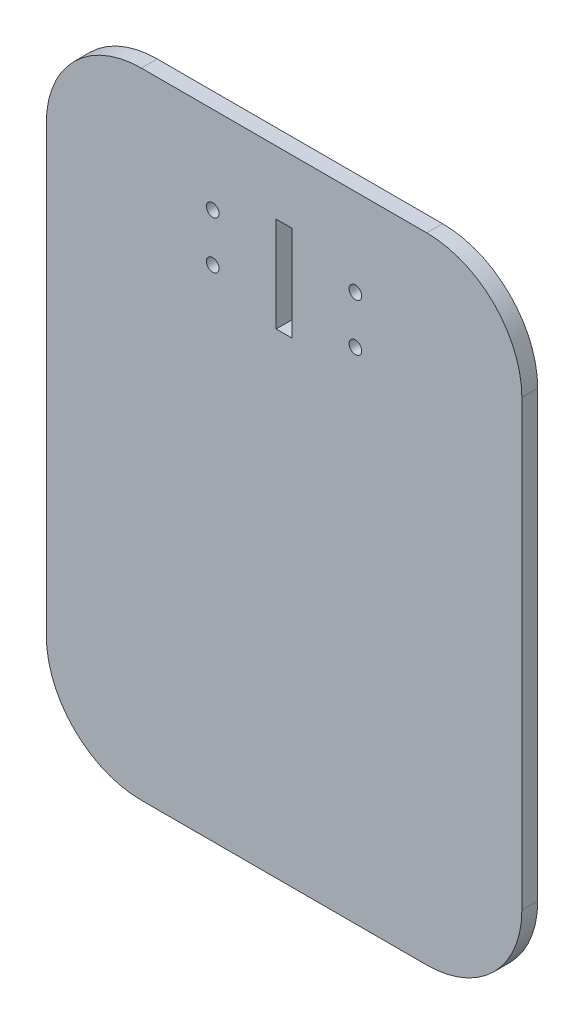
ISO-10303-21;
HEADER;
FILE_DESCRIPTION(('STEP AP214'),'2;1');
FILE_NAME('part.step','',(''),(''),'','','');
FILE_SCHEMA(('AUTOMOTIVE_DESIGN { 1 0 10303 214 1 1 1 1 }'));
ENDSEC;
DATA;
#1=APPLICATION_CONTEXT('core data for automotive mechanical design processes');
#2=APPLICATION_PROTOCOL_DEFINITION('international standard','automotive_design',2000,#1);
#3=PRODUCT_CONTEXT('',#1,'mechanical');
#4=PRODUCT('Part','Part','',(#3));
#5=PRODUCT_RELATED_PRODUCT_CATEGORY('part','',(#4));
#6=PRODUCT_DEFINITION_FORMATION('','',#4);
#7=PRODUCT_DEFINITION_CONTEXT('part definition',#1,'design');
#8=PRODUCT_DEFINITION('design','',#6,#7);
#9=PRODUCT_DEFINITION_SHAPE('','',#8);
#10=(LENGTH_UNIT() NAMED_UNIT(*) SI_UNIT(.MILLI.,.METRE.));
#11=(NAMED_UNIT(*) PLANE_ANGLE_UNIT() SI_UNIT($,.RADIAN.));
#12=(NAMED_UNIT(*) SI_UNIT($,.STERADIAN.) SOLID_ANGLE_UNIT());
#13=UNCERTAINTY_MEASURE_WITH_UNIT(LENGTH_MEASURE(1.E-05),#10,'distance_accuracy_value','');
#14=(GEOMETRIC_REPRESENTATION_CONTEXT(3) GLOBAL_UNCERTAINTY_ASSIGNED_CONTEXT((#13)) GLOBAL_UNIT_ASSIGNED_CONTEXT((#10,
#11,#12)) REPRESENTATION_CONTEXT('',''));
#15=CARTESIAN_POINT('',(0.,0.,0.));
#16=DIRECTION('',(0.,0.,1.));
#17=DIRECTION('',(1.,0.,0.));
#18=AXIS2_PLACEMENT_3D('',#15,#16,#17);
#19=CARTESIAN_POINT('',(0.,0.,5.));
#20=DIRECTION('',(0.,0.,1.));
#21=DIRECTION('',(1.,0.,0.));
#22=AXIS2_PLACEMENT_3D('',#19,#20,#21);
#23=PLANE('',#22);
#24=CARTESIAN_POINT('',(-144.79547436503,96.7780172413793,5.));
#25=DIRECTION('',(0.,0.,1.));
#26=DIRECTION('',(-1.,0.,0.));
#27=AXIS2_PLACEMENT_3D('',#24,#25,#26);
#28=CIRCLE('',#27,2.);
#29=CARTESIAN_POINT('',(-146.79547436503,96.7780172413793,5.));
#30=VERTEX_POINT('',#29);
#31=EDGE_CURVE('E412',#30,#30,#28,.T.);
#32=ORIENTED_EDGE('',*,*,#31,.F.);
#33=EDGE_LOOP('',(#32));
#34=FACE_BOUND('',#33,.T.);
#35=CARTESIAN_POINT('',(-189.79547436503,96.7780172413793,5.));
#36=DIRECTION('',(0.,0.,1.));
#37=DIRECTION('',(1.,0.,0.));
#38=AXIS2_PLACEMENT_3D('',#35,#36,#37);
#39=CIRCLE('',#38,2.);
#40=CARTESIAN_POINT('',(-187.79547436503,96.7780172413793,5.));
#41=VERTEX_POINT('',#40);
#42=EDGE_CURVE('E416',#41,#41,#39,.T.);
#43=ORIENTED_EDGE('',*,*,#42,.F.);
#44=EDGE_LOOP('',(#43));
#45=FACE_BOUND('',#44,.T.);
#46=CARTESIAN_POINT('',(-189.79547436503,111.778017241379,5.));
#47=DIRECTION('',(0.,0.,1.));
#48=DIRECTION('',(-1.,0.,0.));
#49=AXIS2_PLACEMENT_3D('',#46,#47,#48);
#50=CIRCLE('',#49,2.);
#51=CARTESIAN_POINT('',(-191.79547436503,111.778017241379,5.));
#52=VERTEX_POINT('',#51);
#53=EDGE_CURVE('E433',#52,#52,#50,.T.);
#54=ORIENTED_EDGE('',*,*,#53,.F.);
#55=EDGE_LOOP('',(#54));
#56=FACE_BOUND('',#55,.T.);
#57=CARTESIAN_POINT('',(-144.79547436503,111.778017241379,5.));
#58=DIRECTION('',(0.,0.,1.));
#59=DIRECTION('',(1.,0.,0.));
#60=AXIS2_PLACEMENT_3D('',#57,#58,#59);
#61=CIRCLE('',#60,2.);
#62=CARTESIAN_POINT('',(-142.79547436503,111.778017241379,5.));
#63=VERTEX_POINT('',#62);
#64=EDGE_CURVE('E424',#63,#63,#61,.T.);
#65=ORIENTED_EDGE('',*,*,#64,.F.);
#66=EDGE_LOOP('',(#65));
#67=FACE_BOUND('',#66,.T.);
#68=DIRECTION('',(1.,0.,0.));
#69=VECTOR('',#68,1.);
#70=CARTESIAN_POINT('',(-242.29547436503,-60.7219827586207,5.));
#71=LINE('',#70,#69);
#72=CARTESIAN_POINT('',(-212.29547436503,-60.7219827586207,5.));
#73=VERTEX_POINT('',#72);
#74=CARTESIAN_POINT('',(-122.29547436503,-60.7219827586207,5.));
#75=VERTEX_POINT('',#74);
#76=EDGE_CURVE('E170',#73,#75,#71,.T.);
#77=ORIENTED_EDGE('',*,*,#76,.T.);
#78=CARTESIAN_POINT('',(-122.29547436503,-30.7219827586207,5.));
#79=DIRECTION('',(0.,0.,1.));
#80=DIRECTION('',(1.,0.,0.));
#81=AXIS2_PLACEMENT_3D('',#78,#79,#80);
#82=CIRCLE('',#81,30.);
#83=CARTESIAN_POINT('',(-92.2954743650303,-30.7219827586207,5.));
#84=VERTEX_POINT('',#83);
#85=EDGE_CURVE('E210',#75,#84,#82,.T.);
#86=ORIENTED_EDGE('',*,*,#85,.T.);
#87=DIRECTION('',(0.,1.,0.));
#88=VECTOR('',#87,1.);
#89=CARTESIAN_POINT('',(-92.2954743650303,139.278017241379,5.));
#90=LINE('',#89,#88);
#91=CARTESIAN_POINT('',(-92.2954743650303,109.278017241379,5.));
#92=VERTEX_POINT('',#91);
#93=EDGE_CURVE('E174',#84,#92,#90,.T.);
#94=ORIENTED_EDGE('',*,*,#93,.T.);
#95=CARTESIAN_POINT('',(-122.29547436503,109.278017241379,5.));
#96=DIRECTION('',(0.,0.,1.));
#97=DIRECTION('',(1.,0.,0.));
#98=AXIS2_PLACEMENT_3D('',#95,#96,#97);
#99=CIRCLE('',#98,30.);
#100=CARTESIAN_POINT('',(-122.29547436503,139.278017241379,5.));
#101=VERTEX_POINT('',#100);
#102=EDGE_CURVE('E54',#92,#101,#99,.T.);
#103=ORIENTED_EDGE('',*,*,#102,.T.);
#104=DIRECTION('',(-1.,0.,0.));
#105=VECTOR('',#104,1.);
#106=CARTESIAN_POINT('',(-242.29547436503,139.278017241379,5.));
#107=LINE('',#106,#105);
#108=CARTESIAN_POINT('',(-212.29547436503,139.278017241379,5.));
#109=VERTEX_POINT('',#108);
#110=EDGE_CURVE('E176',#101,#109,#107,.T.);
#111=ORIENTED_EDGE('',*,*,#110,.T.);
#112=CARTESIAN_POINT('',(-212.29547436503,109.278017241379,5.));
#113=DIRECTION('',(0.,0.,1.));
#114=DIRECTION('',(1.,0.,0.));
#115=AXIS2_PLACEMENT_3D('',#112,#113,#114);
#116=CIRCLE('',#115,30.);
#117=CARTESIAN_POINT('',(-242.29547436503,109.278017241379,5.));
#118=VERTEX_POINT('',#117);
#119=EDGE_CURVE('E205',#109,#118,#116,.T.);
#120=ORIENTED_EDGE('',*,*,#119,.T.);
#121=DIRECTION('',(0.,-1.,0.));
#122=VECTOR('',#121,1.);
#123=CARTESIAN_POINT('',(-242.29547436503,139.278017241379,5.));
#124=LINE('',#123,#122);
#125=CARTESIAN_POINT('',(-242.29547436503,-30.7219827586207,5.));
#126=VERTEX_POINT('',#125);
#127=EDGE_CURVE('E167',#118,#126,#124,.T.);
#128=ORIENTED_EDGE('',*,*,#127,.T.);
#129=CARTESIAN_POINT('',(-212.29547436503,-30.7219827586207,5.));
#130=DIRECTION('',(0.,0.,1.));
#131=DIRECTION('',(1.,0.,0.));
#132=AXIS2_PLACEMENT_3D('',#129,#130,#131);
#133=CIRCLE('',#132,30.);
#134=EDGE_CURVE('E208',#126,#73,#133,.T.);
#135=ORIENTED_EDGE('',*,*,#134,.T.);
#136=EDGE_LOOP('',(#77,#86,#94,#103,#111,#120,#128,#135));
#137=FACE_BOUND('',#136,.T.);
#138=DIRECTION('',(1.,0.,0.));
#139=VECTOR('',#138,1.);
#140=CARTESIAN_POINT('',(-169.79547436503,89.2780172413793,5.));
#141=LINE('',#140,#139);
#142=CARTESIAN_POINT('',(-169.79547436503,89.2780172413793,5.));
#143=VERTEX_POINT('',#142);
#144=CARTESIAN_POINT('',(-164.79547436503,89.2780172413793,5.));
#145=VERTEX_POINT('',#144);
#146=EDGE_CURVE('E134',#143,#145,#141,.T.);
#147=ORIENTED_EDGE('',*,*,#146,.F.);
#148=DIRECTION('',(0.,-1.,0.));
#149=VECTOR('',#148,1.);
#150=CARTESIAN_POINT('',(-169.79547436503,119.278017241379,5.));
#151=LINE('',#150,#149);
#152=CARTESIAN_POINT('',(-169.79547436503,119.278017241379,5.));
#153=VERTEX_POINT('',#152);
#154=EDGE_CURVE('E124',#153,#143,#151,.T.);
#155=ORIENTED_EDGE('',*,*,#154,.F.);
#156=DIRECTION('',(-1.,0.,0.));
#157=VECTOR('',#156,1.);
#158=CARTESIAN_POINT('',(-169.79547436503,119.278017241379,5.));
#159=LINE('',#158,#157);
#160=CARTESIAN_POINT('',(-164.79547436503,119.278017241379,5.));
#161=VERTEX_POINT('',#160);
#162=EDGE_CURVE('E149',#161,#153,#159,.T.);
#163=ORIENTED_EDGE('',*,*,#162,.F.);
#164=DIRECTION('',(0.,1.,0.));
#165=VECTOR('',#164,1.);
#166=CARTESIAN_POINT('',(-164.79547436503,119.278017241379,5.));
#167=LINE('',#166,#165);
#168=EDGE_CURVE('E147',#145,#161,#167,.T.);
#169=ORIENTED_EDGE('',*,*,#168,.F.);
#170=EDGE_LOOP('',(#147,#155,#163,#169));
#171=FACE_BOUND('',#170,.T.);
#172=ADVANCED_FACE('F33',(#34,#45,#56,#67,#137,#171),#23,.T.);
#173=CARTESIAN_POINT('',(0.,0.,0.));
#174=DIRECTION('',(0.,0.,1.));
#175=DIRECTION('',(1.,0.,0.));
#176=AXIS2_PLACEMENT_3D('',#173,#174,#175);
#177=PLANE('',#176);
#178=CARTESIAN_POINT('',(-144.79547436503,96.7780172413793,0.));
#179=DIRECTION('',(0.,0.,1.));
#180=DIRECTION('',(1.,0.,0.));
#181=AXIS2_PLACEMENT_3D('',#178,#179,#180);
#182=CIRCLE('',#181,2.);
#183=CARTESIAN_POINT('',(-142.79547436503,96.7780172413793,0.));
#184=VERTEX_POINT('',#183);
#185=EDGE_CURVE('E415',#184,#184,#182,.F.);
#186=ORIENTED_EDGE('',*,*,#185,.F.);
#187=EDGE_LOOP('',(#186));
#188=FACE_BOUND('',#187,.T.);
#189=CARTESIAN_POINT('',(-189.79547436503,96.7780172413793,0.));
#190=DIRECTION('',(0.,0.,1.));
#191=DIRECTION('',(1.,0.,0.));
#192=AXIS2_PLACEMENT_3D('',#189,#190,#191);
#193=CIRCLE('',#192,2.);
#194=CARTESIAN_POINT('',(-187.79547436503,96.7780172413793,0.));
#195=VERTEX_POINT('',#194);
#196=EDGE_CURVE('E419',#195,#195,#193,.F.);
#197=ORIENTED_EDGE('',*,*,#196,.F.);
#198=EDGE_LOOP('',(#197));
#199=FACE_BOUND('',#198,.T.);
#200=CARTESIAN_POINT('',(-189.79547436503,111.778017241379,0.));
#201=DIRECTION('',(0.,0.,1.));
#202=DIRECTION('',(1.,0.,0.));
#203=AXIS2_PLACEMENT_3D('',#200,#201,#202);
#204=CIRCLE('',#203,2.);
#205=CARTESIAN_POINT('',(-187.79547436503,111.778017241379,0.));
#206=VERTEX_POINT('',#205);
#207=EDGE_CURVE('E426',#206,#206,#204,.F.);
#208=ORIENTED_EDGE('',*,*,#207,.F.);
#209=EDGE_LOOP('',(#208));
#210=FACE_BOUND('',#209,.T.);
#211=CARTESIAN_POINT('',(-144.79547436503,111.778017241379,0.));
#212=DIRECTION('',(0.,0.,1.));
#213=DIRECTION('',(1.,0.,0.));
#214=AXIS2_PLACEMENT_3D('',#211,#212,#213);
#215=CIRCLE('',#214,2.);
#216=CARTESIAN_POINT('',(-142.79547436503,111.778017241379,0.));
#217=VERTEX_POINT('',#216);
#218=EDGE_CURVE('E156',#217,#217,#215,.F.);
#219=ORIENTED_EDGE('',*,*,#218,.F.);
#220=EDGE_LOOP('',(#219));
#221=FACE_BOUND('',#220,.T.);
#222=DIRECTION('',(0.,1.,0.));
#223=VECTOR('',#222,1.);
#224=CARTESIAN_POINT('',(-92.2954743650303,139.278017241379,0.));
#225=LINE('',#224,#223);
#226=CARTESIAN_POINT('',(-92.2954743650303,-30.7219827586207,0.));
#227=VERTEX_POINT('',#226);
#228=CARTESIAN_POINT('',(-92.2954743650303,109.278017241379,0.));
#229=VERTEX_POINT('',#228);
#230=EDGE_CURVE('E184',#227,#229,#225,.T.);
#231=ORIENTED_EDGE('',*,*,#230,.F.);
#232=CARTESIAN_POINT('',(-122.29547436503,-30.7219827586207,0.));
#233=DIRECTION('',(0.,0.,1.));
#234=DIRECTION('',(1.,0.,0.));
#235=AXIS2_PLACEMENT_3D('',#232,#233,#234);
#236=CIRCLE('',#235,30.);
#237=CARTESIAN_POINT('',(-122.29547436503,-60.7219827586207,0.));
#238=VERTEX_POINT('',#237);
#239=EDGE_CURVE('E198',#227,#238,#236,.F.);
#240=ORIENTED_EDGE('',*,*,#239,.T.);
#241=DIRECTION('',(1.,0.,0.));
#242=VECTOR('',#241,1.);
#243=CARTESIAN_POINT('',(-242.29547436503,-60.7219827586207,0.));
#244=LINE('',#243,#242);
#245=CARTESIAN_POINT('',(-212.29547436503,-60.7219827586207,0.));
#246=VERTEX_POINT('',#245);
#247=EDGE_CURVE('E181',#246,#238,#244,.T.);
#248=ORIENTED_EDGE('',*,*,#247,.F.);
#249=CARTESIAN_POINT('',(-212.29547436503,-30.7219827586207,0.));
#250=DIRECTION('',(0.,0.,1.));
#251=DIRECTION('',(1.,0.,0.));
#252=AXIS2_PLACEMENT_3D('',#249,#250,#251);
#253=CIRCLE('',#252,30.);
#254=CARTESIAN_POINT('',(-242.29547436503,-30.7219827586207,0.));
#255=VERTEX_POINT('',#254);
#256=EDGE_CURVE('E196',#246,#255,#253,.F.);
#257=ORIENTED_EDGE('',*,*,#256,.T.);
#258=DIRECTION('',(0.,-1.,0.));
#259=VECTOR('',#258,1.);
#260=CARTESIAN_POINT('',(-242.29547436503,139.278017241379,0.));
#261=LINE('',#260,#259);
#262=CARTESIAN_POINT('',(-242.29547436503,109.278017241379,0.));
#263=VERTEX_POINT('',#262);
#264=EDGE_CURVE('E142',#263,#255,#261,.T.);
#265=ORIENTED_EDGE('',*,*,#264,.F.);
#266=CARTESIAN_POINT('',(-212.29547436503,109.278017241379,0.));
#267=DIRECTION('',(0.,0.,1.));
#268=DIRECTION('',(1.,0.,0.));
#269=AXIS2_PLACEMENT_3D('',#266,#267,#268);
#270=CIRCLE('',#269,30.);
#271=CARTESIAN_POINT('',(-212.29547436503,139.278017241379,0.));
#272=VERTEX_POINT('',#271);
#273=EDGE_CURVE('E192',#263,#272,#270,.F.);
#274=ORIENTED_EDGE('',*,*,#273,.T.);
#275=DIRECTION('',(-1.,0.,0.));
#276=VECTOR('',#275,1.);
#277=CARTESIAN_POINT('',(-242.29547436503,139.278017241379,0.));
#278=LINE('',#277,#276);
#279=CARTESIAN_POINT('',(-122.29547436503,139.278017241379,0.));
#280=VERTEX_POINT('',#279);
#281=EDGE_CURVE('E171',#280,#272,#278,.T.);
#282=ORIENTED_EDGE('',*,*,#281,.F.);
#283=CARTESIAN_POINT('',(-122.29547436503,109.278017241379,0.));
#284=DIRECTION('',(0.,0.,1.));
#285=DIRECTION('',(1.,0.,0.));
#286=AXIS2_PLACEMENT_3D('',#283,#284,#285);
#287=CIRCLE('',#286,30.);
#288=EDGE_CURVE('E194',#280,#229,#287,.F.);
#289=ORIENTED_EDGE('',*,*,#288,.T.);
#290=EDGE_LOOP('',(#231,#240,#248,#257,#265,#274,#282,#289));
#291=FACE_BOUND('',#290,.T.);
#292=DIRECTION('',(0.,-1.,0.));
#293=VECTOR('',#292,1.);
#294=CARTESIAN_POINT('',(-169.79547436503,119.278017241379,0.));
#295=LINE('',#294,#293);
#296=CARTESIAN_POINT('',(-169.79547436503,119.278017241379,0.));
#297=VERTEX_POINT('',#296);
#298=CARTESIAN_POINT('',(-169.79547436503,89.2780172413793,0.));
#299=VERTEX_POINT('',#298);
#300=EDGE_CURVE('E154',#297,#299,#295,.T.);
#301=ORIENTED_EDGE('',*,*,#300,.T.);
#302=DIRECTION('',(1.,0.,0.));
#303=VECTOR('',#302,1.);
#304=CARTESIAN_POINT('',(-169.79547436503,89.2780172413793,0.));
#305=LINE('',#304,#303);
#306=CARTESIAN_POINT('',(-164.79547436503,89.2780172413793,0.));
#307=VERTEX_POINT('',#306);
#308=EDGE_CURVE('E141',#299,#307,#305,.T.);
#309=ORIENTED_EDGE('',*,*,#308,.T.);
#310=DIRECTION('',(0.,1.,0.));
#311=VECTOR('',#310,1.);
#312=CARTESIAN_POINT('',(-164.79547436503,119.278017241379,0.));
#313=LINE('',#312,#311);
#314=CARTESIAN_POINT('',(-164.79547436503,119.278017241379,0.));
#315=VERTEX_POINT('',#314);
#316=EDGE_CURVE('E158',#307,#315,#313,.T.);
#317=ORIENTED_EDGE('',*,*,#316,.T.);
#318=DIRECTION('',(-1.,0.,0.));
#319=VECTOR('',#318,1.);
#320=CARTESIAN_POINT('',(-169.79547436503,119.278017241379,0.));
#321=LINE('',#320,#319);
#322=EDGE_CURVE('E135',#315,#297,#321,.T.);
#323=ORIENTED_EDGE('',*,*,#322,.T.);
#324=EDGE_LOOP('',(#301,#309,#317,#323));
#325=FACE_BOUND('',#324,.T.);
#326=ADVANCED_FACE('F234',(#188,#199,#210,#221,#291,#325),#177,.F.);
#327=CARTESIAN_POINT('',(-242.29547436503,139.278017241379,5.));
#328=DIRECTION('',(1.,0.,0.));
#329=DIRECTION('',(0.,1.,0.));
#330=AXIS2_PLACEMENT_3D('',#327,#328,#329);
#331=PLANE('',#330);
#332=ORIENTED_EDGE('',*,*,#264,.T.);
#333=DIRECTION('',(0.,0.,-1.));
#334=VECTOR('',#333,1.);
#335=CARTESIAN_POINT('',(-242.29547436503,-30.7219827586207,5.));
#336=LINE('',#335,#334);
#337=EDGE_CURVE('E215',#255,#126,#336,.F.);
#338=ORIENTED_EDGE('',*,*,#337,.T.);
#339=ORIENTED_EDGE('',*,*,#127,.F.);
#340=DIRECTION('',(0.,0.,-1.));
#341=VECTOR('',#340,1.);
#342=CARTESIAN_POINT('',(-242.29547436503,109.278017241379,5.));
#343=LINE('',#342,#341);
#344=EDGE_CURVE('E212',#118,#263,#343,.T.);
#345=ORIENTED_EDGE('',*,*,#344,.T.);
#346=EDGE_LOOP('',(#332,#338,#339,#345));
#347=FACE_BOUND('',#346,.T.);
#348=ADVANCED_FACE('F219',(#347),#331,.F.);
#349=CARTESIAN_POINT('',(-242.29547436503,-60.7219827586207,5.));
#350=DIRECTION('',(0.,1.,0.));
#351=DIRECTION('',(0.,0.,1.));
#352=AXIS2_PLACEMENT_3D('',#349,#350,#351);
#353=PLANE('',#352);
#354=ORIENTED_EDGE('',*,*,#247,.T.);
#355=DIRECTION('',(0.,0.,-1.));
#356=VECTOR('',#355,1.);
#357=CARTESIAN_POINT('',(-122.29547436503,-60.7219827586207,5.));
#358=LINE('',#357,#356);
#359=EDGE_CURVE('E203',#238,#75,#358,.F.);
#360=ORIENTED_EDGE('',*,*,#359,.T.);
#361=ORIENTED_EDGE('',*,*,#76,.F.);
#362=DIRECTION('',(0.,0.,-1.));
#363=VECTOR('',#362,1.);
#364=CARTESIAN_POINT('',(-212.29547436503,-60.7219827586207,5.));
#365=LINE('',#364,#363);
#366=EDGE_CURVE('E200',#73,#246,#365,.T.);
#367=ORIENTED_EDGE('',*,*,#366,.T.);
#368=EDGE_LOOP('',(#354,#360,#361,#367));
#369=FACE_BOUND('',#368,.T.);
#370=ADVANCED_FACE('F230',(#369),#353,.F.);
#371=CARTESIAN_POINT('',(-92.2954743650303,139.278017241379,5.));
#372=DIRECTION('',(-1.,0.,0.));
#373=DIRECTION('',(0.,-1.,0.));
#374=AXIS2_PLACEMENT_3D('',#371,#372,#373);
#375=PLANE('',#374);
#376=ORIENTED_EDGE('',*,*,#93,.F.);
#377=DIRECTION('',(0.,0.,-1.));
#378=VECTOR('',#377,1.);
#379=CARTESIAN_POINT('',(-92.2954743650303,-30.7219827586207,5.));
#380=LINE('',#379,#378);
#381=EDGE_CURVE('E189',#84,#227,#380,.T.);
#382=ORIENTED_EDGE('',*,*,#381,.T.);
#383=ORIENTED_EDGE('',*,*,#230,.T.);
#384=DIRECTION('',(0.,0.,-1.));
#385=VECTOR('',#384,1.);
#386=CARTESIAN_POINT('',(-92.2954743650303,109.278017241379,5.));
#387=LINE('',#386,#385);
#388=EDGE_CURVE('E178',#229,#92,#387,.F.);
#389=ORIENTED_EDGE('',*,*,#388,.T.);
#390=EDGE_LOOP('',(#376,#382,#383,#389));
#391=FACE_BOUND('',#390,.T.);
#392=ADVANCED_FACE('F242',(#391),#375,.F.);
#393=CARTESIAN_POINT('',(-242.29547436503,139.278017241379,5.));
#394=DIRECTION('',(0.,-1.,0.));
#395=DIRECTION('',(0.,0.,-1.));
#396=AXIS2_PLACEMENT_3D('',#393,#394,#395);
#397=PLANE('',#396);
#398=ORIENTED_EDGE('',*,*,#110,.F.);
#399=DIRECTION('',(0.,0.,-1.));
#400=VECTOR('',#399,1.);
#401=CARTESIAN_POINT('',(-122.29547436503,139.278017241379,5.));
#402=LINE('',#401,#400);
#403=EDGE_CURVE('E11',#101,#280,#402,.T.);
#404=ORIENTED_EDGE('',*,*,#403,.T.);
#405=ORIENTED_EDGE('',*,*,#281,.T.);
#406=DIRECTION('',(0.,0.,-1.));
#407=VECTOR('',#406,1.);
#408=CARTESIAN_POINT('',(-212.29547436503,139.278017241379,5.));
#409=LINE('',#408,#407);
#410=EDGE_CURVE('E41',#272,#109,#409,.F.);
#411=ORIENTED_EDGE('',*,*,#410,.T.);
#412=EDGE_LOOP('',(#398,#404,#405,#411));
#413=FACE_BOUND('',#412,.T.);
#414=ADVANCED_FACE('F248',(#413),#397,.F.);
#415=CARTESIAN_POINT('',(-169.79547436503,119.278017241379,5.));
#416=DIRECTION('',(1.,0.,0.));
#417=DIRECTION('',(0.,0.,-1.));
#418=AXIS2_PLACEMENT_3D('',#415,#416,#417);
#419=PLANE('',#418);
#420=ORIENTED_EDGE('',*,*,#300,.F.);
#421=DIRECTION('',(0.,0.,-1.));
#422=VECTOR('',#421,1.);
#423=CARTESIAN_POINT('',(-169.79547436503,119.278017241379,5.));
#424=LINE('',#423,#422);
#425=EDGE_CURVE('E130',#153,#297,#424,.T.);
#426=ORIENTED_EDGE('',*,*,#425,.F.);
#427=ORIENTED_EDGE('',*,*,#154,.T.);
#428=DIRECTION('',(0.,0.,-1.));
#429=VECTOR('',#428,1.);
#430=CARTESIAN_POINT('',(-169.79547436503,89.2780172413793,5.));
#431=LINE('',#430,#429);
#432=EDGE_CURVE('E127',#143,#299,#431,.T.);
#433=ORIENTED_EDGE('',*,*,#432,.T.);
#434=EDGE_LOOP('',(#420,#426,#427,#433));
#435=FACE_BOUND('',#434,.T.);
#436=ADVANCED_FACE('F126',(#435),#419,.T.);
#437=CARTESIAN_POINT('',(-169.79547436503,89.2780172413793,5.));
#438=DIRECTION('',(0.,1.,0.));
#439=DIRECTION('',(0.,0.,1.));
#440=AXIS2_PLACEMENT_3D('',#437,#438,#439);
#441=PLANE('',#440);
#442=ORIENTED_EDGE('',*,*,#308,.F.);
#443=ORIENTED_EDGE('',*,*,#432,.F.);
#444=ORIENTED_EDGE('',*,*,#146,.T.);
#445=DIRECTION('',(0.,0.,-1.));
#446=VECTOR('',#445,1.);
#447=CARTESIAN_POINT('',(-164.79547436503,89.2780172413793,5.));
#448=LINE('',#447,#446);
#449=EDGE_CURVE('E143',#145,#307,#448,.T.);
#450=ORIENTED_EDGE('',*,*,#449,.T.);
#451=EDGE_LOOP('',(#442,#443,#444,#450));
#452=FACE_BOUND('',#451,.T.);
#453=ADVANCED_FACE('F138',(#452),#441,.T.);
#454=CARTESIAN_POINT('',(-164.79547436503,119.278017241379,5.));
#455=DIRECTION('',(-1.,0.,0.));
#456=DIRECTION('',(0.,0.,1.));
#457=AXIS2_PLACEMENT_3D('',#454,#455,#456);
#458=PLANE('',#457);
#459=ORIENTED_EDGE('',*,*,#316,.F.);
#460=ORIENTED_EDGE('',*,*,#449,.F.);
#461=ORIENTED_EDGE('',*,*,#168,.T.);
#462=DIRECTION('',(0.,0.,-1.));
#463=VECTOR('',#462,1.);
#464=CARTESIAN_POINT('',(-164.79547436503,119.278017241379,5.));
#465=LINE('',#464,#463);
#466=EDGE_CURVE('E164',#161,#315,#465,.T.);
#467=ORIENTED_EDGE('',*,*,#466,.T.);
#468=EDGE_LOOP('',(#459,#460,#461,#467));
#469=FACE_BOUND('',#468,.T.);
#470=ADVANCED_FACE('F351',(#469),#458,.T.);
#471=CARTESIAN_POINT('',(-169.79547436503,119.278017241379,5.));
#472=DIRECTION('',(0.,-1.,0.));
#473=DIRECTION('',(0.,0.,-1.));
#474=AXIS2_PLACEMENT_3D('',#471,#472,#473);
#475=PLANE('',#474);
#476=ORIENTED_EDGE('',*,*,#322,.F.);
#477=ORIENTED_EDGE('',*,*,#466,.F.);
#478=ORIENTED_EDGE('',*,*,#162,.T.);
#479=ORIENTED_EDGE('',*,*,#425,.T.);
#480=EDGE_LOOP('',(#476,#477,#478,#479));
#481=FACE_BOUND('',#480,.T.);
#482=ADVANCED_FACE('F282',(#481),#475,.T.);
#483=CARTESIAN_POINT('',(-122.29547436503,-30.7219827586207,5.));
#484=DIRECTION('',(0.,0.,-1.));
#485=DIRECTION('',(-1.,0.,0.));
#486=AXIS2_PLACEMENT_3D('',#483,#484,#485);
#487=CYLINDRICAL_SURFACE('',#486,30.);
#488=ORIENTED_EDGE('',*,*,#85,.F.);
#489=ORIENTED_EDGE('',*,*,#359,.F.);
#490=ORIENTED_EDGE('',*,*,#239,.F.);
#491=ORIENTED_EDGE('',*,*,#381,.F.);
#492=EDGE_LOOP('',(#488,#489,#490,#491));
#493=FACE_BOUND('',#492,.T.);
#494=ADVANCED_FACE('F239',(#493),#487,.T.);
#495=CARTESIAN_POINT('',(-212.29547436503,-30.7219827586207,5.));
#496=DIRECTION('',(0.,0.,-1.));
#497=DIRECTION('',(-1.,0.,0.));
#498=AXIS2_PLACEMENT_3D('',#495,#496,#497);
#499=CYLINDRICAL_SURFACE('',#498,30.);
#500=ORIENTED_EDGE('',*,*,#134,.F.);
#501=ORIENTED_EDGE('',*,*,#337,.F.);
#502=ORIENTED_EDGE('',*,*,#256,.F.);
#503=ORIENTED_EDGE('',*,*,#366,.F.);
#504=EDGE_LOOP('',(#500,#501,#502,#503));
#505=FACE_BOUND('',#504,.T.);
#506=ADVANCED_FACE('F227',(#505),#499,.T.);
#507=CARTESIAN_POINT('',(-122.29547436503,109.278017241379,5.));
#508=DIRECTION('',(0.,0.,-1.));
#509=DIRECTION('',(-1.,0.,0.));
#510=AXIS2_PLACEMENT_3D('',#507,#508,#509);
#511=CYLINDRICAL_SURFACE('',#510,30.);
#512=ORIENTED_EDGE('',*,*,#102,.F.);
#513=ORIENTED_EDGE('',*,*,#388,.F.);
#514=ORIENTED_EDGE('',*,*,#288,.F.);
#515=ORIENTED_EDGE('',*,*,#403,.F.);
#516=EDGE_LOOP('',(#512,#513,#514,#515));
#517=FACE_BOUND('',#516,.T.);
#518=ADVANCED_FACE('F246',(#517),#511,.T.);
#519=CARTESIAN_POINT('',(-212.29547436503,109.278017241379,5.));
#520=DIRECTION('',(0.,0.,-1.));
#521=DIRECTION('',(-1.,0.,0.));
#522=AXIS2_PLACEMENT_3D('',#519,#520,#521);
#523=CYLINDRICAL_SURFACE('',#522,30.);
#524=ORIENTED_EDGE('',*,*,#119,.F.);
#525=ORIENTED_EDGE('',*,*,#410,.F.);
#526=ORIENTED_EDGE('',*,*,#273,.F.);
#527=ORIENTED_EDGE('',*,*,#344,.F.);
#528=EDGE_LOOP('',(#524,#525,#526,#527));
#529=FACE_BOUND('',#528,.T.);
#530=ADVANCED_FACE('F35',(#529),#523,.T.);
#531=CARTESIAN_POINT('',(-144.79547436503,111.778017241379,-0.00100000000000013));
#532=DIRECTION('',(0.,0.,1.));
#533=DIRECTION('',(1.,0.,0.));
#534=AXIS2_PLACEMENT_3D('',#531,#532,#533);
#535=CYLINDRICAL_SURFACE('',#534,2.);
#536=ORIENTED_EDGE('',*,*,#64,.T.);
#537=EDGE_LOOP('',(#536));
#538=FACE_BOUND('',#537,.T.);
#539=ORIENTED_EDGE('',*,*,#218,.T.);
#540=EDGE_LOOP('',(#539));
#541=FACE_BOUND('',#540,.T.);
#542=ADVANCED_FACE('F251',(#538,#541),#535,.F.);
#543=CARTESIAN_POINT('',(-189.79547436503,111.778017241379,-0.00100000000000013));
#544=DIRECTION('',(0.,0.,1.));
#545=DIRECTION('',(1.,0.,0.));
#546=AXIS2_PLACEMENT_3D('',#543,#544,#545);
#547=CYLINDRICAL_SURFACE('',#546,2.);
#548=ORIENTED_EDGE('',*,*,#53,.T.);
#549=EDGE_LOOP('',(#548));
#550=FACE_BOUND('',#549,.T.);
#551=ORIENTED_EDGE('',*,*,#207,.T.);
#552=EDGE_LOOP('',(#551));
#553=FACE_BOUND('',#552,.T.);
#554=ADVANCED_FACE('F256',(#550,#553),#547,.F.);
#555=CARTESIAN_POINT('',(-189.79547436503,96.7780172413793,-0.00100000000000013));
#556=DIRECTION('',(0.,0.,1.));
#557=DIRECTION('',(1.,0.,0.));
#558=AXIS2_PLACEMENT_3D('',#555,#556,#557);
#559=CYLINDRICAL_SURFACE('',#558,2.);
#560=ORIENTED_EDGE('',*,*,#42,.T.);
#561=EDGE_LOOP('',(#560));
#562=FACE_BOUND('',#561,.T.);
#563=ORIENTED_EDGE('',*,*,#196,.T.);
#564=EDGE_LOOP('',(#563));
#565=FACE_BOUND('',#564,.T.);
#566=ADVANCED_FACE('F323',(#562,#565),#559,.F.);
#567=CARTESIAN_POINT('',(-144.79547436503,96.7780172413793,-0.00100000000000013));
#568=DIRECTION('',(0.,0.,1.));
#569=DIRECTION('',(1.,0.,0.));
#570=AXIS2_PLACEMENT_3D('',#567,#568,#569);
#571=CYLINDRICAL_SURFACE('',#570,2.);
#572=ORIENTED_EDGE('',*,*,#31,.T.);
#573=EDGE_LOOP('',(#572));
#574=FACE_BOUND('',#573,.T.);
#575=ORIENTED_EDGE('',*,*,#185,.T.);
#576=EDGE_LOOP('',(#575));
#577=FACE_BOUND('',#576,.T.);
#578=ADVANCED_FACE('F333',(#574,#577),#571,.F.);
#579=CLOSED_SHELL('',(#172,#326,#348,#370,#392,#414,#436,#453,#470,#482,#494,#506,#518,#530,
#542,#554,#566,#578));
#580=MANIFOLD_SOLID_BREP('B2',#579);
#581=ADVANCED_BREP_SHAPE_REPRESENTATION('',(#18,#580),#14);
#582=SHAPE_DEFINITION_REPRESENTATION(#9,#581);
ENDSEC;
END-ISO-10303-21;
